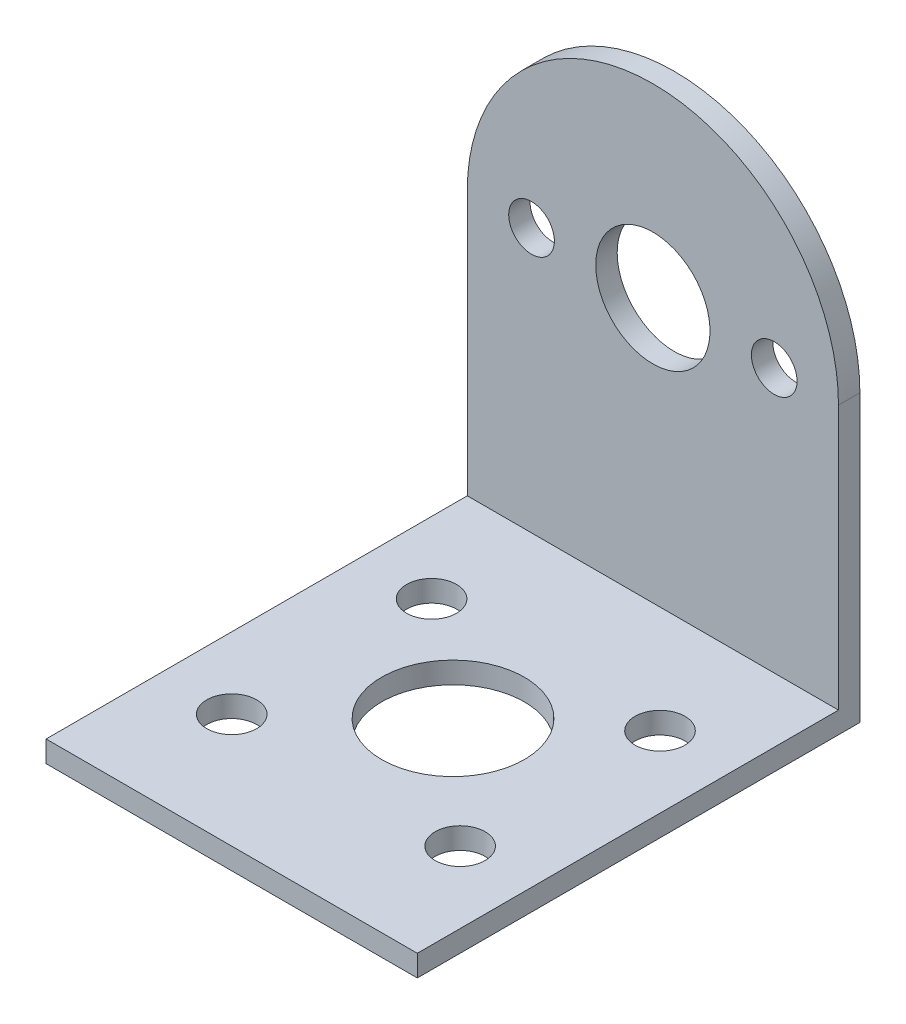
ISO-10303-21;
HEADER;
FILE_DESCRIPTION(('STEP AP214'),'2;1');
FILE_NAME('part.step','',(''),(''),'','','');
FILE_SCHEMA(('AUTOMOTIVE_DESIGN { 1 0 10303 214 1 1 1 1 }'));
ENDSEC;
DATA;
#1=APPLICATION_CONTEXT('core data for automotive mechanical design processes');
#2=APPLICATION_PROTOCOL_DEFINITION('international standard','automotive_design',2000,#1);
#3=PRODUCT_CONTEXT('',#1,'mechanical');
#4=PRODUCT('Part','Part','',(#3));
#5=PRODUCT_RELATED_PRODUCT_CATEGORY('part','',(#4));
#6=PRODUCT_DEFINITION_FORMATION('','',#4);
#7=PRODUCT_DEFINITION_CONTEXT('part definition',#1,'design');
#8=PRODUCT_DEFINITION('design','',#6,#7);
#9=PRODUCT_DEFINITION_SHAPE('','',#8);
#10=(LENGTH_UNIT() NAMED_UNIT(*) SI_UNIT(.MILLI.,.METRE.));
#11=(NAMED_UNIT(*) PLANE_ANGLE_UNIT() SI_UNIT($,.RADIAN.));
#12=(NAMED_UNIT(*) SI_UNIT($,.STERADIAN.) SOLID_ANGLE_UNIT());
#13=UNCERTAINTY_MEASURE_WITH_UNIT(LENGTH_MEASURE(1.E-05),#10,'distance_accuracy_value','');
#14=(GEOMETRIC_REPRESENTATION_CONTEXT(3) GLOBAL_UNCERTAINTY_ASSIGNED_CONTEXT((#13)) GLOBAL_UNIT_ASSIGNED_CONTEXT((#10,
#11,#12)) REPRESENTATION_CONTEXT('',''));
#15=CARTESIAN_POINT('',(0.,0.,0.));
#16=DIRECTION('',(0.,0.,1.));
#17=DIRECTION('',(1.,0.,0.));
#18=AXIS2_PLACEMENT_3D('',#15,#16,#17);
#19=CARTESIAN_POINT('',(0.,1.5,0.));
#20=DIRECTION('',(0.,-1.,0.));
#21=DIRECTION('',(0.,0.,-1.));
#22=AXIS2_PLACEMENT_3D('',#19,#20,#21);
#23=PLANE('',#22);
#24=CARTESIAN_POINT('',(-8.,1.5,7.5));
#25=DIRECTION('',(0.,1.,0.));
#26=DIRECTION('',(0.,0.,1.));
#27=AXIS2_PLACEMENT_3D('',#24,#25,#26);
#28=CIRCLE('',#27,1.75);
#29=CARTESIAN_POINT('',(-8.,1.5,9.25));
#30=VERTEX_POINT('',#29);
#31=EDGE_CURVE('E180',#30,#30,#28,.T.);
#32=ORIENTED_EDGE('',*,*,#31,.F.);
#33=EDGE_LOOP('',(#32));
#34=FACE_BOUND('',#33,.T.);
#35=CARTESIAN_POINT('',(8.,1.5,7.5));
#36=DIRECTION('',(0.,1.,0.));
#37=DIRECTION('',(0.,0.,1.));
#38=AXIS2_PLACEMENT_3D('',#35,#36,#37);
#39=CIRCLE('',#38,1.75);
#40=CARTESIAN_POINT('',(8.,1.5,9.25));
#41=VERTEX_POINT('',#40);
#42=EDGE_CURVE('E186',#41,#41,#39,.T.);
#43=ORIENTED_EDGE('',*,*,#42,.F.);
#44=EDGE_LOOP('',(#43));
#45=FACE_BOUND('',#44,.T.);
#46=CARTESIAN_POINT('',(8.,1.5,-6.5));
#47=DIRECTION('',(0.,1.,0.));
#48=DIRECTION('',(0.,0.,1.));
#49=AXIS2_PLACEMENT_3D('',#46,#47,#48);
#50=CIRCLE('',#49,1.75);
#51=CARTESIAN_POINT('',(8.,1.5,-4.75));
#52=VERTEX_POINT('',#51);
#53=EDGE_CURVE('E192',#52,#52,#50,.T.);
#54=ORIENTED_EDGE('',*,*,#53,.F.);
#55=EDGE_LOOP('',(#54));
#56=FACE_BOUND('',#55,.T.);
#57=CARTESIAN_POINT('',(-8.,1.5,-6.5));
#58=DIRECTION('',(0.,1.,0.));
#59=DIRECTION('',(0.,0.,1.));
#60=AXIS2_PLACEMENT_3D('',#57,#58,#59);
#61=CIRCLE('',#60,1.75);
#62=CARTESIAN_POINT('',(-8.,1.5,-4.75));
#63=VERTEX_POINT('',#62);
#64=EDGE_CURVE('E198',#63,#63,#61,.T.);
#65=ORIENTED_EDGE('',*,*,#64,.F.);
#66=EDGE_LOOP('',(#65));
#67=FACE_BOUND('',#66,.T.);
#68=CARTESIAN_POINT('',(0.,1.5,0.));
#69=DIRECTION('',(0.,1.,0.));
#70=DIRECTION('',(0.,0.,1.));
#71=AXIS2_PLACEMENT_3D('',#68,#69,#70);
#72=CIRCLE('',#71,5.);
#73=CARTESIAN_POINT('',(0.,1.5,5.));
#74=VERTEX_POINT('',#73);
#75=EDGE_CURVE('E105',#74,#74,#72,.T.);
#76=ORIENTED_EDGE('',*,*,#75,.F.);
#77=EDGE_LOOP('',(#76));
#78=FACE_BOUND('',#77,.T.);
#79=DIRECTION('',(1.,0.,0.));
#80=VECTOR('',#79,1.);
#81=CARTESIAN_POINT('',(0.,1.5,-14.));
#82=LINE('',#81,#80);
#83=CARTESIAN_POINT('',(-13.,1.5,-14.));
#84=VERTEX_POINT('',#83);
#85=CARTESIAN_POINT('',(13.,1.5,-14.));
#86=VERTEX_POINT('',#85);
#87=EDGE_CURVE('E58',#84,#86,#82,.T.);
#88=ORIENTED_EDGE('',*,*,#87,.F.);
#89=DIRECTION('',(0.,0.,1.));
#90=VECTOR('',#89,1.);
#91=CARTESIAN_POINT('',(-13.,1.5,15.5));
#92=LINE('',#91,#90);
#93=CARTESIAN_POINT('',(-13.,1.5,15.5));
#94=VERTEX_POINT('',#93);
#95=EDGE_CURVE('E155',#84,#94,#92,.T.);
#96=ORIENTED_EDGE('',*,*,#95,.T.);
#97=DIRECTION('',(1.,0.,0.));
#98=VECTOR('',#97,1.);
#99=CARTESIAN_POINT('',(-13.,1.5,15.5));
#100=LINE('',#99,#98);
#101=CARTESIAN_POINT('',(13.,1.5,15.5));
#102=VERTEX_POINT('',#101);
#103=EDGE_CURVE('E64',#94,#102,#100,.T.);
#104=ORIENTED_EDGE('',*,*,#103,.T.);
#105=DIRECTION('',(0.,0.,-1.));
#106=VECTOR('',#105,1.);
#107=CARTESIAN_POINT('',(13.,1.5,15.5));
#108=LINE('',#107,#106);
#109=EDGE_CURVE('E93',#102,#86,#108,.T.);
#110=ORIENTED_EDGE('',*,*,#109,.T.);
#111=EDGE_LOOP('',(#88,#96,#104,#110));
#112=FACE_BOUND('',#111,.T.);
#113=ADVANCED_FACE('F43',(#34,#45,#56,#67,#78,#112),#23,.F.);
#114=CARTESIAN_POINT('',(0.,0.,0.));
#115=DIRECTION('',(0.,-1.,0.));
#116=DIRECTION('',(0.,0.,-1.));
#117=AXIS2_PLACEMENT_3D('',#114,#115,#116);
#118=PLANE('',#117);
#119=CARTESIAN_POINT('',(8.,0.,7.5));
#120=DIRECTION('',(0.,1.,0.));
#121=DIRECTION('',(0.,0.,1.));
#122=AXIS2_PLACEMENT_3D('',#119,#120,#121);
#123=CIRCLE('',#122,1.75);
#124=CARTESIAN_POINT('',(8.,0.,9.25));
#125=VERTEX_POINT('',#124);
#126=EDGE_CURVE('E183',#125,#125,#123,.T.);
#127=ORIENTED_EDGE('',*,*,#126,.T.);
#128=EDGE_LOOP('',(#127));
#129=FACE_BOUND('',#128,.T.);
#130=CARTESIAN_POINT('',(-8.,0.,-6.5));
#131=DIRECTION('',(0.,1.,0.));
#132=DIRECTION('',(0.,0.,1.));
#133=AXIS2_PLACEMENT_3D('',#130,#131,#132);
#134=CIRCLE('',#133,1.75);
#135=CARTESIAN_POINT('',(-8.,0.,-4.75));
#136=VERTEX_POINT('',#135);
#137=EDGE_CURVE('E195',#136,#136,#134,.T.);
#138=ORIENTED_EDGE('',*,*,#137,.T.);
#139=EDGE_LOOP('',(#138));
#140=FACE_BOUND('',#139,.T.);
#141=DIRECTION('',(0.,0.,-1.));
#142=VECTOR('',#141,1.);
#143=CARTESIAN_POINT('',(13.,0.,15.5));
#144=LINE('',#143,#142);
#145=CARTESIAN_POINT('',(13.,0.,15.5));
#146=VERTEX_POINT('',#145);
#147=CARTESIAN_POINT('',(13.,0.,-15.5));
#148=VERTEX_POINT('',#147);
#149=EDGE_CURVE('E99',#146,#148,#144,.T.);
#150=ORIENTED_EDGE('',*,*,#149,.F.);
#151=DIRECTION('',(1.,0.,0.));
#152=VECTOR('',#151,1.);
#153=CARTESIAN_POINT('',(-13.,0.,15.5));
#154=LINE('',#153,#152);
#155=CARTESIAN_POINT('',(-13.,0.,15.5));
#156=VERTEX_POINT('',#155);
#157=EDGE_CURVE('E83',#156,#146,#154,.T.);
#158=ORIENTED_EDGE('',*,*,#157,.F.);
#159=DIRECTION('',(0.,0.,1.));
#160=VECTOR('',#159,1.);
#161=CARTESIAN_POINT('',(-13.,0.,15.5));
#162=LINE('',#161,#160);
#163=CARTESIAN_POINT('',(-13.,0.,-15.5));
#164=VERTEX_POINT('',#163);
#165=EDGE_CURVE('E94',#164,#156,#162,.T.);
#166=ORIENTED_EDGE('',*,*,#165,.F.);
#167=DIRECTION('',(-1.,0.,0.));
#168=VECTOR('',#167,1.);
#169=CARTESIAN_POINT('',(-13.,0.,-15.5));
#170=LINE('',#169,#168);
#171=EDGE_CURVE('E104',#148,#164,#170,.T.);
#172=ORIENTED_EDGE('',*,*,#171,.F.);
#173=EDGE_LOOP('',(#150,#158,#166,#172));
#174=FACE_BOUND('',#173,.T.);
#175=CARTESIAN_POINT('',(0.,0.,0.));
#176=DIRECTION('',(0.,1.,0.));
#177=DIRECTION('',(0.,0.,1.));
#178=AXIS2_PLACEMENT_3D('',#175,#176,#177);
#179=CIRCLE('',#178,5.);
#180=CARTESIAN_POINT('',(0.,0.,5.));
#181=VERTEX_POINT('',#180);
#182=EDGE_CURVE('E109',#181,#181,#179,.T.);
#183=ORIENTED_EDGE('',*,*,#182,.T.);
#184=EDGE_LOOP('',(#183));
#185=FACE_BOUND('',#184,.T.);
#186=CARTESIAN_POINT('',(8.,0.,-6.5));
#187=DIRECTION('',(0.,1.,0.));
#188=DIRECTION('',(0.,0.,1.));
#189=AXIS2_PLACEMENT_3D('',#186,#187,#188);
#190=CIRCLE('',#189,1.75);
#191=CARTESIAN_POINT('',(8.,0.,-4.75));
#192=VERTEX_POINT('',#191);
#193=EDGE_CURVE('E189',#192,#192,#190,.T.);
#194=ORIENTED_EDGE('',*,*,#193,.T.);
#195=EDGE_LOOP('',(#194));
#196=FACE_BOUND('',#195,.T.);
#197=CARTESIAN_POINT('',(-8.,0.,7.5));
#198=DIRECTION('',(0.,1.,0.));
#199=DIRECTION('',(0.,0.,1.));
#200=AXIS2_PLACEMENT_3D('',#197,#198,#199);
#201=CIRCLE('',#200,1.75);
#202=CARTESIAN_POINT('',(-8.,0.,9.25));
#203=VERTEX_POINT('',#202);
#204=EDGE_CURVE('E178',#203,#203,#201,.T.);
#205=ORIENTED_EDGE('',*,*,#204,.T.);
#206=EDGE_LOOP('',(#205));
#207=FACE_BOUND('',#206,.T.);
#208=ADVANCED_FACE('F102',(#129,#140,#174,#185,#196,#207),#118,.T.);
#209=CARTESIAN_POINT('',(13.,1.5,15.5));
#210=DIRECTION('',(-1.,0.,0.));
#211=DIRECTION('',(0.,0.,1.));
#212=AXIS2_PLACEMENT_3D('',#209,#210,#211);
#213=PLANE('',#212);
#214=ORIENTED_EDGE('',*,*,#149,.T.);
#215=DIRECTION('',(0.,-1.,0.));
#216=VECTOR('',#215,1.);
#217=CARTESIAN_POINT('',(13.,1.5,-15.5));
#218=LINE('',#217,#216);
#219=CARTESIAN_POINT('',(13.,20.,-15.5));
#220=VERTEX_POINT('',#219);
#221=EDGE_CURVE('E11',#220,#148,#218,.T.);
#222=ORIENTED_EDGE('',*,*,#221,.F.);
#223=DIRECTION('',(0.,0.,-1.));
#224=VECTOR('',#223,1.);
#225=CARTESIAN_POINT('',(13.,20.,-14.));
#226=LINE('',#225,#224);
#227=CARTESIAN_POINT('',(13.,20.,-14.));
#228=VERTEX_POINT('',#227);
#229=EDGE_CURVE('E144',#228,#220,#226,.T.);
#230=ORIENTED_EDGE('',*,*,#229,.F.);
#231=DIRECTION('',(0.,1.,0.));
#232=VECTOR('',#231,1.);
#233=CARTESIAN_POINT('',(13.,0.,-14.));
#234=LINE('',#233,#232);
#235=EDGE_CURVE('E152',#86,#228,#234,.T.);
#236=ORIENTED_EDGE('',*,*,#235,.F.);
#237=ORIENTED_EDGE('',*,*,#109,.F.);
#238=DIRECTION('',(0.,-1.,0.));
#239=VECTOR('',#238,1.);
#240=CARTESIAN_POINT('',(13.,1.5,15.5));
#241=LINE('',#240,#239);
#242=EDGE_CURVE('E86',#102,#146,#241,.T.);
#243=ORIENTED_EDGE('',*,*,#242,.T.);
#244=EDGE_LOOP('',(#214,#222,#230,#236,#237,#243));
#245=FACE_BOUND('',#244,.T.);
#246=ADVANCED_FACE('F45',(#245),#213,.F.);
#247=CARTESIAN_POINT('',(-13.,1.5,-15.5));
#248=DIRECTION('',(0.,0.,1.));
#249=DIRECTION('',(1.,0.,0.));
#250=AXIS2_PLACEMENT_3D('',#247,#248,#249);
#251=PLANE('',#250);
#252=ORIENTED_EDGE('',*,*,#171,.T.);
#253=DIRECTION('',(0.,-1.,0.));
#254=VECTOR('',#253,1.);
#255=CARTESIAN_POINT('',(-13.,1.5,-15.5));
#256=LINE('',#255,#254);
#257=CARTESIAN_POINT('',(-13.,20.,-15.5));
#258=VERTEX_POINT('',#257);
#259=EDGE_CURVE('E51',#258,#164,#256,.T.);
#260=ORIENTED_EDGE('',*,*,#259,.F.);
#261=CARTESIAN_POINT('',(0.,20.,-15.5));
#262=DIRECTION('',(0.,0.,-1.));
#263=DIRECTION('',(-1.,0.,0.));
#264=AXIS2_PLACEMENT_3D('',#261,#262,#263);
#265=CIRCLE('',#264,13.);
#266=EDGE_CURVE('E130',#258,#220,#265,.T.);
#267=ORIENTED_EDGE('',*,*,#266,.T.);
#268=ORIENTED_EDGE('',*,*,#221,.T.);
#269=EDGE_LOOP('',(#252,#260,#267,#268));
#270=FACE_BOUND('',#269,.T.);
#271=CARTESIAN_POINT('',(0.,20.,-15.5));
#272=DIRECTION('',(0.,0.,-1.));
#273=DIRECTION('',(-1.,0.,0.));
#274=AXIS2_PLACEMENT_3D('',#271,#272,#273);
#275=CIRCLE('',#274,4.);
#276=CARTESIAN_POINT('',(-4.,20.,-15.5));
#277=VERTEX_POINT('',#276);
#278=EDGE_CURVE('E173',#277,#277,#275,.T.);
#279=ORIENTED_EDGE('',*,*,#278,.F.);
#280=EDGE_LOOP('',(#279));
#281=FACE_BOUND('',#280,.T.);
#282=CARTESIAN_POINT('',(8.5,20.,-15.5));
#283=DIRECTION('',(0.,0.,-1.));
#284=DIRECTION('',(-1.,0.,0.));
#285=AXIS2_PLACEMENT_3D('',#282,#283,#284);
#286=CIRCLE('',#285,1.6);
#287=CARTESIAN_POINT('',(6.9,20.,-15.5));
#288=VERTEX_POINT('',#287);
#289=EDGE_CURVE('E159',#288,#288,#286,.T.);
#290=ORIENTED_EDGE('',*,*,#289,.F.);
#291=EDGE_LOOP('',(#290));
#292=FACE_BOUND('',#291,.T.);
#293=CARTESIAN_POINT('',(-8.5,20.,-15.5));
#294=DIRECTION('',(0.,0.,-1.));
#295=DIRECTION('',(-1.,0.,0.));
#296=AXIS2_PLACEMENT_3D('',#293,#294,#295);
#297=CIRCLE('',#296,1.6);
#298=CARTESIAN_POINT('',(-10.1,20.,-15.5));
#299=VERTEX_POINT('',#298);
#300=EDGE_CURVE('E156',#299,#299,#297,.F.);
#301=ORIENTED_EDGE('',*,*,#300,.T.);
#302=EDGE_LOOP('',(#301));
#303=FACE_BOUND('',#302,.T.);
#304=ADVANCED_FACE('F127',(#270,#281,#292,#303),#251,.F.);
#305=CARTESIAN_POINT('',(-13.,1.5,15.5));
#306=DIRECTION('',(1.,0.,0.));
#307=DIRECTION('',(0.,0.,-1.));
#308=AXIS2_PLACEMENT_3D('',#305,#306,#307);
#309=PLANE('',#308);
#310=ORIENTED_EDGE('',*,*,#165,.T.);
#311=DIRECTION('',(0.,-1.,0.));
#312=VECTOR('',#311,1.);
#313=CARTESIAN_POINT('',(-13.,1.5,15.5));
#314=LINE('',#313,#312);
#315=EDGE_CURVE('E89',#94,#156,#314,.T.);
#316=ORIENTED_EDGE('',*,*,#315,.F.);
#317=ORIENTED_EDGE('',*,*,#95,.F.);
#318=DIRECTION('',(0.,1.,0.));
#319=VECTOR('',#318,1.);
#320=CARTESIAN_POINT('',(-13.,0.,-14.));
#321=LINE('',#320,#319);
#322=CARTESIAN_POINT('',(-13.,20.,-14.));
#323=VERTEX_POINT('',#322);
#324=EDGE_CURVE('E151',#84,#323,#321,.T.);
#325=ORIENTED_EDGE('',*,*,#324,.T.);
#326=DIRECTION('',(0.,0.,-1.));
#327=VECTOR('',#326,1.);
#328=CARTESIAN_POINT('',(-13.,20.,-14.));
#329=LINE('',#328,#327);
#330=EDGE_CURVE('E123',#323,#258,#329,.T.);
#331=ORIENTED_EDGE('',*,*,#330,.T.);
#332=ORIENTED_EDGE('',*,*,#259,.T.);
#333=EDGE_LOOP('',(#310,#316,#317,#325,#331,#332));
#334=FACE_BOUND('',#333,.T.);
#335=ADVANCED_FACE('F119',(#334),#309,.F.);
#336=CARTESIAN_POINT('',(-13.,1.5,15.5));
#337=DIRECTION('',(0.,0.,-1.));
#338=DIRECTION('',(-1.,0.,0.));
#339=AXIS2_PLACEMENT_3D('',#336,#337,#338);
#340=PLANE('',#339);
#341=ORIENTED_EDGE('',*,*,#157,.T.);
#342=ORIENTED_EDGE('',*,*,#242,.F.);
#343=ORIENTED_EDGE('',*,*,#103,.F.);
#344=ORIENTED_EDGE('',*,*,#315,.T.);
#345=EDGE_LOOP('',(#341,#342,#343,#344));
#346=FACE_BOUND('',#345,.T.);
#347=ADVANCED_FACE('F85',(#346),#340,.F.);
#348=CARTESIAN_POINT('',(0.,1.5,0.));
#349=DIRECTION('',(0.,-1.,0.));
#350=DIRECTION('',(0.,0.,-1.));
#351=AXIS2_PLACEMENT_3D('',#348,#349,#350);
#352=CYLINDRICAL_SURFACE('',#351,5.);
#353=ORIENTED_EDGE('',*,*,#75,.T.);
#354=EDGE_LOOP('',(#353));
#355=FACE_BOUND('',#354,.T.);
#356=ORIENTED_EDGE('',*,*,#182,.F.);
#357=EDGE_LOOP('',(#356));
#358=FACE_BOUND('',#357,.T.);
#359=ADVANCED_FACE('F218',(#355,#358),#352,.F.);
#360=CARTESIAN_POINT('',(-8.,1.5,-6.5));
#361=DIRECTION('',(0.,-1.,0.));
#362=DIRECTION('',(0.,0.,-1.));
#363=AXIS2_PLACEMENT_3D('',#360,#361,#362);
#364=CYLINDRICAL_SURFACE('',#363,1.75);
#365=ORIENTED_EDGE('',*,*,#64,.T.);
#366=EDGE_LOOP('',(#365));
#367=FACE_BOUND('',#366,.T.);
#368=ORIENTED_EDGE('',*,*,#137,.F.);
#369=EDGE_LOOP('',(#368));
#370=FACE_BOUND('',#369,.T.);
#371=ADVANCED_FACE('F311',(#367,#370),#364,.F.);
#372=CARTESIAN_POINT('',(8.,1.5,-6.5));
#373=DIRECTION('',(0.,-1.,0.));
#374=DIRECTION('',(0.,0.,-1.));
#375=AXIS2_PLACEMENT_3D('',#372,#373,#374);
#376=CYLINDRICAL_SURFACE('',#375,1.75);
#377=ORIENTED_EDGE('',*,*,#53,.T.);
#378=EDGE_LOOP('',(#377));
#379=FACE_BOUND('',#378,.T.);
#380=ORIENTED_EDGE('',*,*,#193,.F.);
#381=EDGE_LOOP('',(#380));
#382=FACE_BOUND('',#381,.T.);
#383=ADVANCED_FACE('F308',(#379,#382),#376,.F.);
#384=CARTESIAN_POINT('',(8.,1.5,7.5));
#385=DIRECTION('',(0.,-1.,0.));
#386=DIRECTION('',(0.,0.,-1.));
#387=AXIS2_PLACEMENT_3D('',#384,#385,#386);
#388=CYLINDRICAL_SURFACE('',#387,1.75);
#389=ORIENTED_EDGE('',*,*,#42,.T.);
#390=EDGE_LOOP('',(#389));
#391=FACE_BOUND('',#390,.T.);
#392=ORIENTED_EDGE('',*,*,#126,.F.);
#393=EDGE_LOOP('',(#392));
#394=FACE_BOUND('',#393,.T.);
#395=ADVANCED_FACE('F304',(#391,#394),#388,.F.);
#396=CARTESIAN_POINT('',(-8.,1.5,7.5));
#397=DIRECTION('',(0.,-1.,0.));
#398=DIRECTION('',(0.,0.,-1.));
#399=AXIS2_PLACEMENT_3D('',#396,#397,#398);
#400=CYLINDRICAL_SURFACE('',#399,1.75);
#401=ORIENTED_EDGE('',*,*,#31,.T.);
#402=EDGE_LOOP('',(#401));
#403=FACE_BOUND('',#402,.T.);
#404=ORIENTED_EDGE('',*,*,#204,.F.);
#405=EDGE_LOOP('',(#404));
#406=FACE_BOUND('',#405,.T.);
#407=ADVANCED_FACE('F263',(#403,#406),#400,.F.);
#408=CARTESIAN_POINT('',(8.5,20.,-14.));
#409=DIRECTION('',(0.,0.,-1.));
#410=DIRECTION('',(-1.,0.,0.));
#411=AXIS2_PLACEMENT_3D('',#408,#409,#410);
#412=CYLINDRICAL_SURFACE('',#411,1.6);
#413=CARTESIAN_POINT('',(8.5,20.,-14.));
#414=DIRECTION('',(0.,0.,-1.));
#415=DIRECTION('',(-1.,0.,0.));
#416=AXIS2_PLACEMENT_3D('',#413,#414,#415);
#417=CIRCLE('',#416,1.6);
#418=CARTESIAN_POINT('',(6.9,20.,-14.));
#419=VERTEX_POINT('',#418);
#420=EDGE_CURVE('E167',#419,#419,#417,.T.);
#421=ORIENTED_EDGE('',*,*,#420,.F.);
#422=EDGE_LOOP('',(#421));
#423=FACE_BOUND('',#422,.T.);
#424=ORIENTED_EDGE('',*,*,#289,.T.);
#425=EDGE_LOOP('',(#424));
#426=FACE_BOUND('',#425,.T.);
#427=ADVANCED_FACE('F257',(#423,#426),#412,.F.);
#428=CARTESIAN_POINT('',(0.,20.,-14.));
#429=DIRECTION('',(0.,0.,-1.));
#430=DIRECTION('',(-1.,0.,0.));
#431=AXIS2_PLACEMENT_3D('',#428,#429,#430);
#432=CYLINDRICAL_SURFACE('',#431,4.);
#433=CARTESIAN_POINT('',(0.,20.,-14.));
#434=DIRECTION('',(0.,0.,-1.));
#435=DIRECTION('',(-1.,0.,0.));
#436=AXIS2_PLACEMENT_3D('',#433,#434,#435);
#437=CIRCLE('',#436,4.);
#438=CARTESIAN_POINT('',(-4.,20.,-14.));
#439=VERTEX_POINT('',#438);
#440=EDGE_CURVE('E164',#439,#439,#437,.T.);
#441=ORIENTED_EDGE('',*,*,#440,.F.);
#442=EDGE_LOOP('',(#441));
#443=FACE_BOUND('',#442,.T.);
#444=ORIENTED_EDGE('',*,*,#278,.T.);
#445=EDGE_LOOP('',(#444));
#446=FACE_BOUND('',#445,.T.);
#447=ADVANCED_FACE('F262',(#443,#446),#432,.F.);
#448=CARTESIAN_POINT('',(0.,20.,-14.));
#449=DIRECTION('',(0.,0.,-1.));
#450=DIRECTION('',(-1.,0.,0.));
#451=AXIS2_PLACEMENT_3D('',#448,#449,#450);
#452=CYLINDRICAL_SURFACE('',#451,13.);
#453=ORIENTED_EDGE('',*,*,#266,.F.);
#454=ORIENTED_EDGE('',*,*,#330,.F.);
#455=CARTESIAN_POINT('',(0.,20.,-14.));
#456=DIRECTION('',(0.,0.,-1.));
#457=DIRECTION('',(-1.,0.,0.));
#458=AXIS2_PLACEMENT_3D('',#455,#456,#457);
#459=CIRCLE('',#458,13.);
#460=EDGE_CURVE('E143',#323,#228,#459,.T.);
#461=ORIENTED_EDGE('',*,*,#460,.T.);
#462=ORIENTED_EDGE('',*,*,#229,.T.);
#463=EDGE_LOOP('',(#453,#454,#461,#462));
#464=FACE_BOUND('',#463,.T.);
#465=ADVANCED_FACE('F141',(#464),#452,.T.);
#466=CARTESIAN_POINT('',(-8.5,20.,-14.));
#467=DIRECTION('',(0.,0.,-1.));
#468=DIRECTION('',(-1.,0.,0.));
#469=AXIS2_PLACEMENT_3D('',#466,#467,#468);
#470=CYLINDRICAL_SURFACE('',#469,1.6);
#471=CARTESIAN_POINT('',(-8.5,20.,-14.));
#472=DIRECTION('',(0.,0.,-1.));
#473=DIRECTION('',(-1.,0.,0.));
#474=AXIS2_PLACEMENT_3D('',#471,#472,#473);
#475=CIRCLE('',#474,1.6);
#476=CARTESIAN_POINT('',(-10.1,20.,-14.));
#477=VERTEX_POINT('',#476);
#478=EDGE_CURVE('E145',#477,#477,#475,.F.);
#479=ORIENTED_EDGE('',*,*,#478,.T.);
#480=EDGE_LOOP('',(#479));
#481=FACE_BOUND('',#480,.T.);
#482=ORIENTED_EDGE('',*,*,#300,.F.);
#483=EDGE_LOOP('',(#482));
#484=FACE_BOUND('',#483,.T.);
#485=ADVANCED_FACE('F282',(#481,#484),#470,.F.);
#486=CARTESIAN_POINT('',(0.,0.,-14.));
#487=DIRECTION('',(0.,0.,-1.));
#488=DIRECTION('',(-1.,0.,0.));
#489=AXIS2_PLACEMENT_3D('',#486,#487,#488);
#490=PLANE('',#489);
#491=ORIENTED_EDGE('',*,*,#324,.F.);
#492=ORIENTED_EDGE('',*,*,#87,.T.);
#493=ORIENTED_EDGE('',*,*,#235,.T.);
#494=ORIENTED_EDGE('',*,*,#460,.F.);
#495=EDGE_LOOP('',(#491,#492,#493,#494));
#496=FACE_BOUND('',#495,.T.);
#497=ORIENTED_EDGE('',*,*,#440,.T.);
#498=EDGE_LOOP('',(#497));
#499=FACE_BOUND('',#498,.T.);
#500=ORIENTED_EDGE('',*,*,#420,.T.);
#501=EDGE_LOOP('',(#500));
#502=FACE_BOUND('',#501,.T.);
#503=ORIENTED_EDGE('',*,*,#478,.F.);
#504=EDGE_LOOP('',(#503));
#505=FACE_BOUND('',#504,.T.);
#506=ADVANCED_FACE('F149',(#496,#499,#502,#505),#490,.F.);
#507=CLOSED_SHELL('',(#113,#208,#246,#304,#335,#347,#359,#371,#383,#395,#407,#427,#447,#465,
#485,#506));
#508=MANIFOLD_SOLID_BREP('B2',#507);
#509=ADVANCED_BREP_SHAPE_REPRESENTATION('',(#18,#508),#14);
#510=SHAPE_DEFINITION_REPRESENTATION(#9,#509);
ENDSEC;
END-ISO-10303-21;
